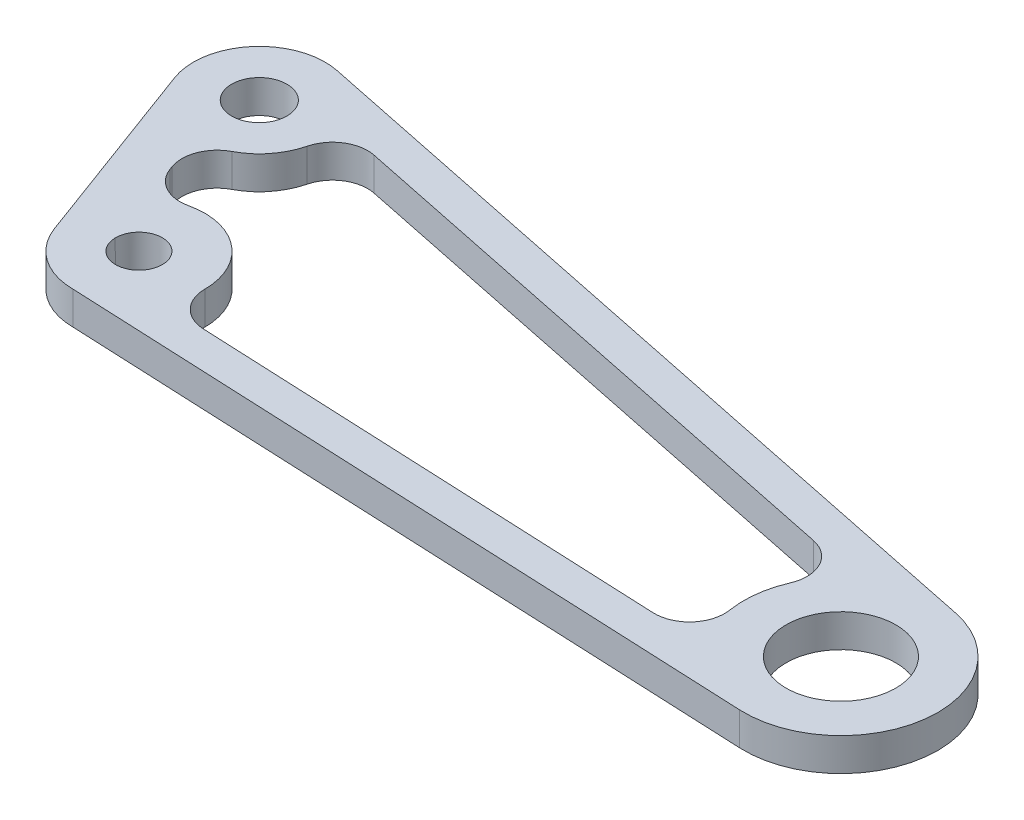
ISO-10303-21;
HEADER;
FILE_DESCRIPTION(('STEP AP214'),'2;1');
FILE_NAME('part.step','',(''),(''),'','','');
FILE_SCHEMA(('AUTOMOTIVE_DESIGN { 1 0 10303 214 1 1 1 1 }'));
ENDSEC;
DATA;
#1=APPLICATION_CONTEXT('core data for automotive mechanical design processes');
#2=APPLICATION_PROTOCOL_DEFINITION('international standard','automotive_design',2000,#1);
#3=PRODUCT_CONTEXT('',#1,'mechanical');
#4=PRODUCT('Part','Part','',(#3));
#5=PRODUCT_RELATED_PRODUCT_CATEGORY('part','',(#4));
#6=PRODUCT_DEFINITION_FORMATION('','',#4);
#7=PRODUCT_DEFINITION_CONTEXT('part definition',#1,'design');
#8=PRODUCT_DEFINITION('design','',#6,#7);
#9=PRODUCT_DEFINITION_SHAPE('','',#8);
#10=(LENGTH_UNIT() NAMED_UNIT(*) SI_UNIT(.MILLI.,.METRE.));
#11=(NAMED_UNIT(*) PLANE_ANGLE_UNIT() SI_UNIT($,.RADIAN.));
#12=(NAMED_UNIT(*) SI_UNIT($,.STERADIAN.) SOLID_ANGLE_UNIT());
#13=UNCERTAINTY_MEASURE_WITH_UNIT(LENGTH_MEASURE(1.E-05),#10,'distance_accuracy_value','');
#14=(GEOMETRIC_REPRESENTATION_CONTEXT(3) GLOBAL_UNCERTAINTY_ASSIGNED_CONTEXT((#13)) GLOBAL_UNIT_ASSIGNED_CONTEXT((#10,
#11,#12)) REPRESENTATION_CONTEXT('',''));
#15=CARTESIAN_POINT('',(0.,0.,0.));
#16=DIRECTION('',(0.,0.,1.));
#17=DIRECTION('',(1.,0.,0.));
#18=AXIS2_PLACEMENT_3D('',#15,#16,#17);
#19=CARTESIAN_POINT('',(0.,4.7625,0.));
#20=DIRECTION('',(0.,-1.,0.));
#21=DIRECTION('',(0.,0.,-1.));
#22=AXIS2_PLACEMENT_3D('',#19,#20,#21);
#23=CYLINDRICAL_SURFACE('',#22,3.3782);
#24=CARTESIAN_POINT('',(0.,4.7625,0.));
#25=DIRECTION('',(0.,1.,0.));
#26=DIRECTION('',(0.,0.,1.));
#27=AXIS2_PLACEMENT_3D('',#24,#25,#26);
#28=CIRCLE('',#27,3.3782);
#29=CARTESIAN_POINT('',(-3.37699494452161,4.7625,0.0902240803526804));
#30=VERTEX_POINT('',#29);
#31=CARTESIAN_POINT('',(3.37815685421566,4.7625,-0.0170736146063141));
#32=VERTEX_POINT('',#31);
#33=EDGE_CURVE('E238',#30,#32,#28,.T.);
#34=ORIENTED_EDGE('',*,*,#33,.T.);
#35=CARTESIAN_POINT('',(0.,3.17500000000001,0.));
#36=DIRECTION('',(-0.0158776138891677,0.0230363081876063,-0.999608538320013));
#37=DIRECTION('',(-0.000365858695107219,-0.99973462904167,-0.0230334027518643));
#38=AXIS2_PLACEMENT_3D('',#35,#36,#37);
#39=ELLIPSE('',#38,146.646761819999,3.3782);
#40=CARTESIAN_POINT('',(3.37581983633548,0.,-0.126789875794162));
#41=VERTEX_POINT('',#40);
#42=EDGE_CURVE('E12',#32,#41,#39,.T.);
#43=ORIENTED_EDGE('',*,*,#42,.T.);
#44=CARTESIAN_POINT('',(0.,0.,0.));
#45=DIRECTION('',(0.,1.,0.));
#46=DIRECTION('',(0.,0.,1.));
#47=AXIS2_PLACEMENT_3D('',#44,#45,#46);
#48=CIRCLE('',#47,3.3782);
#49=CARTESIAN_POINT('',(-3.37814365572359,0.,-0.0195110556985716));
#50=VERTEX_POINT('',#49);
#51=EDGE_CURVE('E217',#50,#41,#48,.T.);
#52=ORIENTED_EDGE('',*,*,#51,.F.);
#53=CARTESIAN_POINT('',(0.,3.17500000000001,0.));
#54=DIRECTION('',(-0.0158776138891677,0.0230363081876063,-0.999608538320013));
#55=DIRECTION('',(-0.000365858695107219,-0.99973462904167,-0.0230334027518643));
#56=AXIS2_PLACEMENT_3D('',#53,#54,#55);
#57=ELLIPSE('',#56,146.646761819999,3.3782);
#58=EDGE_CURVE('E59',#50,#30,#57,.T.);
#59=ORIENTED_EDGE('',*,*,#58,.T.);
#60=EDGE_LOOP('',(#34,#43,#52,#59));
#61=FACE_BOUND('',#60,.T.);
#62=ADVANCED_FACE('F50',(#61),#23,.F.);
#63=CARTESIAN_POINT('',(0.,4.7625,0.));
#64=DIRECTION('',(0.,1.,0.));
#65=DIRECTION('',(0.,0.,1.));
#66=AXIS2_PLACEMENT_3D('',#63,#64,#65);
#67=PLANE('',#66);
#68=DIRECTION('',(0.979429173631594,0.,0.201788240091771));
#69=VECTOR('',#68,1.);
#70=CARTESIAN_POINT('',(6.96734629176327,4.7625,-33.8177399131058));
#71=LINE('',#70,#69);
#72=CARTESIAN_POINT('',(-8.30441673152731,4.7625,-36.9641258555849));
#73=VERTEX_POINT('',#72);
#74=CARTESIAN_POINT('',(104.396235267328,4.7625,-13.744819308159));
#75=VERTEX_POINT('',#74);
#76=EDGE_CURVE('E189',#73,#75,#71,.T.);
#77=ORIENTED_EDGE('',*,*,#76,.F.);
#78=CARTESIAN_POINT('',(-10.2264497184014,4.7625,-27.635062976744));
#79=DIRECTION('',(0.,1.,0.));
#80=DIRECTION('',(0.,0.,1.));
#81=AXIS2_PLACEMENT_3D('',#78,#79,#80);
#82=CIRCLE('',#81,9.52500000000002);
#83=CARTESIAN_POINT('',(-19.1594284411659,4.7625,-24.3293836004829));
#84=VERTEX_POINT('',#83);
#85=EDGE_CURVE('E199',#73,#84,#82,.T.);
#86=ORIENTED_EDGE('',*,*,#85,.T.);
#87=DIRECTION('',(0.347052952888308,0.,0.937845535198364));
#88=VECTOR('',#87,1.);
#89=CARTESIAN_POINT('',(-8.93297872276443,4.7625,3.30567937626113));
#90=LINE('',#89,#88);
#91=CARTESIAN_POINT('',(-8.93297872276443,4.7625,3.30567937626113));
#92=VERTEX_POINT('',#91);
#93=EDGE_CURVE('E205',#84,#92,#90,.T.);
#94=ORIENTED_EDGE('',*,*,#93,.T.);
#95=CARTESIAN_POINT('',(0.,4.7625,0.));
#96=DIRECTION('',(0.,1.,0.));
#97=DIRECTION('',(0.,0.,1.));
#98=AXIS2_PLACEMENT_3D('',#95,#96,#97);
#99=CIRCLE('',#98,9.525);
#100=CARTESIAN_POINT('',(0.,4.7625,9.525));
#101=VERTEX_POINT('',#100);
#102=EDGE_CURVE('E225',#92,#101,#99,.T.);
#103=ORIENTED_EDGE('',*,*,#102,.T.);
#104=DIRECTION('',(0.999010124972066,0.,0.044483369963356));
#105=VECTOR('',#104,1.);
#106=CARTESIAN_POINT('',(-0.42328468479423,4.7625,9.5061522138136));
#107=LINE('',#106,#105);
#108=CARTESIAN_POINT('',(100.940182627619,4.7625,14.0196085887955));
#109=VERTEX_POINT('',#108);
#110=EDGE_CURVE('E228',#101,#109,#107,.T.);
#111=ORIENTED_EDGE('',*,*,#110,.T.);
#112=CARTESIAN_POINT('',(101.56444,4.7625,0.));
#113=DIRECTION('',(0.,1.,0.));
#114=DIRECTION('',(0.,0.,1.));
#115=AXIS2_PLACEMENT_3D('',#112,#113,#114);
#116=CIRCLE('',#115,14.0335);
#117=EDGE_CURVE('E210',#109,#75,#116,.T.);
#118=ORIENTED_EDGE('',*,*,#117,.T.);
#119=EDGE_LOOP('',(#77,#86,#94,#103,#111,#118));
#120=FACE_BOUND('',#119,.T.);
#121=CARTESIAN_POINT('',(101.56444,4.7625,0.));
#122=DIRECTION('',(0.,1.,0.));
#123=DIRECTION('',(0.,0.,1.));
#124=AXIS2_PLACEMENT_3D('',#121,#122,#123);
#125=CIRCLE('',#124,7.93749999999999);
#126=CARTESIAN_POINT('',(101.56444,4.7625,-7.93749999999999));
#127=VERTEX_POINT('',#126);
#128=EDGE_CURVE('E233',#127,#127,#125,.T.);
#129=ORIENTED_EDGE('',*,*,#128,.F.);
#130=EDGE_LOOP('',(#129));
#131=FACE_BOUND('',#130,.T.);
#132=ORIENTED_EDGE('',*,*,#33,.F.);
#133=EDGE_CURVE('E237',#32,#30,#28,.T.);
#134=ORIENTED_EDGE('',*,*,#133,.F.);
#135=EDGE_LOOP('',(#132,#134));
#136=FACE_BOUND('',#135,.T.);
#137=CARTESIAN_POINT('',(-10.2264497184014,4.7625,-27.635062976744));
#138=DIRECTION('',(0.,1.,0.));
#139=DIRECTION('',(0.,0.,1.));
#140=AXIS2_PLACEMENT_3D('',#137,#138,#139);
#141=CIRCLE('',#140,4.);
#142=CARTESIAN_POINT('',(-10.2264497184014,4.7625,-31.635062976744));
#143=VERTEX_POINT('',#142);
#144=EDGE_CURVE('E241',#143,#143,#141,.T.);
#145=ORIENTED_EDGE('',*,*,#144,.F.);
#146=EDGE_LOOP('',(#145));
#147=FACE_BOUND('',#146,.T.);
#148=DIRECTION('',(0.999010124972066,0.,0.044483369963356));
#149=VECTOR('',#148,1.);
#150=CARTESIAN_POINT('',(-0.197309165380382,4.7625,4.4311807789555));
#151=LINE('',#150,#149);
#152=CARTESIAN_POINT('',(14.379023534751,4.7625,5.08022765445843));
#153=VERTEX_POINT('',#152);
#154=CARTESIAN_POINT('',(82.4677979648595,4.7625,8.11204691996457));
#155=VERTEX_POINT('',#154);
#156=EDGE_CURVE('E442',#153,#155,#151,.T.);
#157=ORIENTED_EDGE('',*,*,#156,.F.);
#158=CARTESIAN_POINT('',(14.6049990541648,4.7625,0.00525621960033242));
#159=DIRECTION('',(0.,1.,0.));
#160=DIRECTION('',(0.,0.,1.));
#161=AXIS2_PLACEMENT_3D('',#158,#159,#160);
#162=CIRCLE('',#161,5.08);
#163=CARTESIAN_POINT('',(9.52499938315098,4.7625,0.00342796930456462));
#164=VERTEX_POINT('',#163);
#165=EDGE_CURVE('E360',#153,#164,#162,.F.);
#166=ORIENTED_EDGE('',*,*,#165,.T.);
#167=CARTESIAN_POINT('',(0.,4.7625,0.));
#168=DIRECTION('',(0.,1.,0.));
#169=DIRECTION('',(0.,0.,1.));
#170=AXIS2_PLACEMENT_3D('',#167,#168,#169);
#171=CIRCLE('',#170,9.525);
#172=CARTESIAN_POINT('',(-2.11226746056986,4.7625,-9.28783888614665));
#173=VERTEX_POINT('',#172);
#174=EDGE_CURVE('E450',#164,#173,#171,.T.);
#175=ORIENTED_EDGE('',*,*,#174,.T.);
#176=CARTESIAN_POINT('',(-3.23881010620712,4.7625,-14.2413529587582));
#177=DIRECTION('',(0.,1.,0.));
#178=DIRECTION('',(0.,0.,1.));
#179=AXIS2_PLACEMENT_3D('',#176,#177,#178);
#180=CIRCLE('',#179,5.08);
#181=CARTESIAN_POINT('',(-8.00306542501481,4.7625,-12.4783239580856));
#182=VERTEX_POINT('',#181);
#183=EDGE_CURVE('E330',#173,#182,#180,.F.);
#184=ORIENTED_EDGE('',*,*,#183,.T.);
#185=DIRECTION('',(0.347052952888308,0.,0.937845535198364));
#186=VECTOR('',#185,1.);
#187=CARTESIAN_POINT('',(-2.97765957425481,4.7625,1.10189312542038));
#188=LINE('',#187,#186);
#189=CARTESIAN_POINT('',(-8.17870344189627,4.7625,-12.9529527678176));
#190=VERTEX_POINT('',#189);
#191=EDGE_CURVE('E220',#190,#182,#188,.T.);
#192=ORIENTED_EDGE('',*,*,#191,.F.);
#193=CARTESIAN_POINT('',(-3.41444812308858,4.7625,-14.7159817684902));
#194=DIRECTION('',(0.,1.,0.));
#195=DIRECTION('',(0.,0.,1.));
#196=AXIS2_PLACEMENT_3D('',#193,#194,#195);
#197=CIRCLE('',#196,5.08);
#198=CARTESIAN_POINT('',(-5.78383998232783,4.7625,-19.2095752322307));
#199=VERTEX_POINT('',#198);
#200=EDGE_CURVE('E336',#190,#199,#197,.F.);
#201=ORIENTED_EDGE('',*,*,#200,.T.);
#202=CARTESIAN_POINT('',(-10.2264497184014,4.7625,-27.635062976744));
#203=DIRECTION('',(0.,1.,0.));
#204=DIRECTION('',(0.,0.,1.));
#205=AXIS2_PLACEMENT_3D('',#202,#203,#204);
#206=CIRCLE('',#205,9.52500000000001);
#207=CARTESIAN_POINT('',(-0.989775302005681,4.7625,-25.3092360860447));
#208=VERTEX_POINT('',#207);
#209=EDGE_CURVE('E461',#199,#208,#206,.T.);
#210=ORIENTED_EDGE('',*,*,#209,.T.);
#211=CARTESIAN_POINT('',(3.93645105340539,4.7625,-24.0687950776717));
#212=DIRECTION('',(0.,1.,0.));
#213=DIRECTION('',(0.,0.,1.));
#214=AXIS2_PLACEMENT_3D('',#211,#212,#213);
#215=CIRCLE('',#214,5.08);
#216=CARTESIAN_POINT('',(4.96153531307158,4.7625,-29.0442952797202));
#217=VERTEX_POINT('',#216);
#218=EDGE_CURVE('E354',#208,#217,#215,.F.);
#219=ORIENTED_EDGE('',*,*,#218,.T.);
#220=DIRECTION('',(0.979429173631593,0.,0.20178824009177));
#221=VECTOR('',#220,1.);
#222=CARTESIAN_POINT('',(5.94226203209708,4.7625,-28.8422397110573));
#223=LINE('',#222,#221);
#224=CARTESIAN_POINT('',(85.0392852900803,4.7625,-12.5461669071959));
#225=VERTEX_POINT('',#224);
#226=EDGE_CURVE('E454',#217,#225,#223,.T.);
#227=ORIENTED_EDGE('',*,*,#226,.T.);
#228=CARTESIAN_POINT('',(84.0142010304141,4.7625,-7.57066670514743));
#229=DIRECTION('',(0.,1.,0.));
#230=DIRECTION('',(0.,0.,1.));
#231=AXIS2_PLACEMENT_3D('',#228,#229,#230);
#232=CIRCLE('',#231,5.08);
#233=CARTESIAN_POINT('',(88.6787163711678,4.7625,-5.55852937487568));
#234=VERTEX_POINT('',#233);
#235=EDGE_CURVE('E342',#225,#234,#232,.F.);
#236=ORIENTED_EDGE('',*,*,#235,.T.);
#237=CARTESIAN_POINT('',(101.56444,4.7625,0.));
#238=DIRECTION('',(0.,1.,0.));
#239=DIRECTION('',(0.,0.,1.));
#240=AXIS2_PLACEMENT_3D('',#237,#238,#239);
#241=CIRCLE('',#240,14.0335);
#242=CARTESIAN_POINT('',(87.7092330233369,4.7625,2.22987934288549));
#243=VERTEX_POINT('',#242);
#244=EDGE_CURVE('E449',#234,#243,#241,.T.);
#245=ORIENTED_EDGE('',*,*,#244,.T.);
#246=CARTESIAN_POINT('',(82.6937734842734,4.7625,3.03707548510648));
#247=DIRECTION('',(0.,1.,0.));
#248=DIRECTION('',(0.,0.,1.));
#249=AXIS2_PLACEMENT_3D('',#246,#247,#248);
#250=CIRCLE('',#249,5.08);
#251=EDGE_CURVE('E348',#243,#155,#250,.F.);
#252=ORIENTED_EDGE('',*,*,#251,.T.);
#253=EDGE_LOOP('',(#157,#166,#175,#184,#192,#201,#210,#219,#227,#236,#245,#252));
#254=FACE_BOUND('',#253,.T.);
#255=ADVANCED_FACE('F207',(#120,#131,#136,#147,#254),#67,.T.);
#256=CARTESIAN_POINT('',(0.,0.,0.));
#257=DIRECTION('',(0.,1.,0.));
#258=DIRECTION('',(0.,0.,1.));
#259=AXIS2_PLACEMENT_3D('',#256,#257,#258);
#260=PLANE('',#259);
#261=CARTESIAN_POINT('',(-10.2264497184014,0.,-27.635062976744));
#262=DIRECTION('',(0.,1.,0.));
#263=DIRECTION('',(0.,0.,1.));
#264=AXIS2_PLACEMENT_3D('',#261,#262,#263);
#265=CIRCLE('',#264,4.);
#266=CARTESIAN_POINT('',(-10.2264497184014,0.,-31.635062976744));
#267=VERTEX_POINT('',#266);
#268=EDGE_CURVE('E213',#267,#267,#265,.T.);
#269=ORIENTED_EDGE('',*,*,#268,.T.);
#270=EDGE_LOOP('',(#269));
#271=FACE_BOUND('',#270,.T.);
#272=ORIENTED_EDGE('',*,*,#51,.T.);
#273=EDGE_CURVE('E269',#41,#50,#48,.T.);
#274=ORIENTED_EDGE('',*,*,#273,.T.);
#275=EDGE_LOOP('',(#272,#274));
#276=FACE_BOUND('',#275,.T.);
#277=CARTESIAN_POINT('',(101.56444,0.,0.));
#278=DIRECTION('',(0.,1.,0.));
#279=DIRECTION('',(0.,0.,1.));
#280=AXIS2_PLACEMENT_3D('',#277,#278,#279);
#281=CIRCLE('',#280,7.93749999999999);
#282=CARTESIAN_POINT('',(101.56444,0.,-7.93749999999999));
#283=VERTEX_POINT('',#282);
#284=EDGE_CURVE('E265',#283,#283,#281,.T.);
#285=ORIENTED_EDGE('',*,*,#284,.T.);
#286=EDGE_LOOP('',(#285));
#287=FACE_BOUND('',#286,.T.);
#288=DIRECTION('',(0.979429173631594,0.,0.201788240091771));
#289=VECTOR('',#288,1.);
#290=CARTESIAN_POINT('',(6.96734629176327,0.,-33.8177399131058));
#291=LINE('',#290,#289);
#292=CARTESIAN_POINT('',(-8.30441673152731,0.,-36.9641258555849));
#293=VERTEX_POINT('',#292);
#294=CARTESIAN_POINT('',(104.396235267328,0.,-13.744819308159));
#295=VERTEX_POINT('',#294);
#296=EDGE_CURVE('E191',#293,#295,#291,.T.);
#297=ORIENTED_EDGE('',*,*,#296,.T.);
#298=CARTESIAN_POINT('',(101.56444,0.,0.));
#299=DIRECTION('',(0.,1.,0.));
#300=DIRECTION('',(0.,0.,1.));
#301=AXIS2_PLACEMENT_3D('',#298,#299,#300);
#302=CIRCLE('',#301,14.0335);
#303=CARTESIAN_POINT('',(100.940182627619,0.,14.0196085887955));
#304=VERTEX_POINT('',#303);
#305=EDGE_CURVE('E261',#304,#295,#302,.T.);
#306=ORIENTED_EDGE('',*,*,#305,.F.);
#307=DIRECTION('',(0.999010124972066,0.,0.044483369963356));
#308=VECTOR('',#307,1.);
#309=CARTESIAN_POINT('',(-0.42328468479423,0.,9.5061522138136));
#310=LINE('',#309,#308);
#311=CARTESIAN_POINT('',(0.,0.,9.525));
#312=VERTEX_POINT('',#311);
#313=EDGE_CURVE('E258',#312,#304,#310,.T.);
#314=ORIENTED_EDGE('',*,*,#313,.F.);
#315=CARTESIAN_POINT('',(0.,0.,0.));
#316=DIRECTION('',(0.,1.,0.));
#317=DIRECTION('',(0.,0.,1.));
#318=AXIS2_PLACEMENT_3D('',#315,#316,#317);
#319=CIRCLE('',#318,9.525);
#320=CARTESIAN_POINT('',(-8.93297872276443,0.,3.30567937626113));
#321=VERTEX_POINT('',#320);
#322=EDGE_CURVE('E255',#321,#312,#319,.T.);
#323=ORIENTED_EDGE('',*,*,#322,.F.);
#324=DIRECTION('',(0.347052952888308,0.,0.937845535198364));
#325=VECTOR('',#324,1.);
#326=CARTESIAN_POINT('',(-8.93297872276443,0.,3.30567937626113));
#327=LINE('',#326,#325);
#328=CARTESIAN_POINT('',(-19.1594284411659,0.,-24.3293836004829));
#329=VERTEX_POINT('',#328);
#330=EDGE_CURVE('E252',#329,#321,#327,.T.);
#331=ORIENTED_EDGE('',*,*,#330,.F.);
#332=CARTESIAN_POINT('',(-10.2264497184014,0.,-27.635062976744));
#333=DIRECTION('',(0.,1.,0.));
#334=DIRECTION('',(0.,0.,1.));
#335=AXIS2_PLACEMENT_3D('',#332,#333,#334);
#336=CIRCLE('',#335,9.52500000000002);
#337=EDGE_CURVE('E248',#293,#329,#336,.T.);
#338=ORIENTED_EDGE('',*,*,#337,.F.);
#339=EDGE_LOOP('',(#297,#306,#314,#323,#331,#338));
#340=FACE_BOUND('',#339,.T.);
#341=CARTESIAN_POINT('',(0.,0.,0.));
#342=DIRECTION('',(0.,1.,0.));
#343=DIRECTION('',(0.,0.,1.));
#344=AXIS2_PLACEMENT_3D('',#341,#342,#343);
#345=CIRCLE('',#344,9.525);
#346=CARTESIAN_POINT('',(9.52499938315098,0.,0.00342796930456462));
#347=VERTEX_POINT('',#346);
#348=CARTESIAN_POINT('',(-2.11226746056986,0.,-9.28783888614665));
#349=VERTEX_POINT('',#348);
#350=EDGE_CURVE('E425',#347,#349,#345,.T.);
#351=ORIENTED_EDGE('',*,*,#350,.F.);
#352=CARTESIAN_POINT('',(14.6049990541648,0.,0.00525621960033242));
#353=DIRECTION('',(0.,1.,0.));
#354=DIRECTION('',(0.,0.,1.));
#355=AXIS2_PLACEMENT_3D('',#352,#353,#354);
#356=CIRCLE('',#355,5.08);
#357=CARTESIAN_POINT('',(14.379023534751,0.,5.08022765445843));
#358=VERTEX_POINT('',#357);
#359=EDGE_CURVE('E363',#347,#358,#356,.T.);
#360=ORIENTED_EDGE('',*,*,#359,.T.);
#361=DIRECTION('',(0.999010124972066,0.,0.044483369963356));
#362=VECTOR('',#361,1.);
#363=CARTESIAN_POINT('',(-0.197309165380382,0.,4.4311807789555));
#364=LINE('',#363,#362);
#365=CARTESIAN_POINT('',(82.4677979648595,0.,8.11204691996457));
#366=VERTEX_POINT('',#365);
#367=EDGE_CURVE('E433',#358,#366,#364,.T.);
#368=ORIENTED_EDGE('',*,*,#367,.T.);
#369=CARTESIAN_POINT('',(82.6937734842734,0.,3.03707548510648));
#370=DIRECTION('',(0.,1.,0.));
#371=DIRECTION('',(0.,0.,1.));
#372=AXIS2_PLACEMENT_3D('',#369,#370,#371);
#373=CIRCLE('',#372,5.08);
#374=CARTESIAN_POINT('',(87.7092330233369,0.,2.22987934288549));
#375=VERTEX_POINT('',#374);
#376=EDGE_CURVE('E351',#366,#375,#373,.T.);
#377=ORIENTED_EDGE('',*,*,#376,.T.);
#378=CARTESIAN_POINT('',(101.56444,0.,0.));
#379=DIRECTION('',(0.,1.,0.));
#380=DIRECTION('',(0.,0.,1.));
#381=AXIS2_PLACEMENT_3D('',#378,#379,#380);
#382=CIRCLE('',#381,14.0335);
#383=CARTESIAN_POINT('',(88.6787163711678,0.,-5.55852937487568));
#384=VERTEX_POINT('',#383);
#385=EDGE_CURVE('E516',#384,#375,#382,.T.);
#386=ORIENTED_EDGE('',*,*,#385,.F.);
#387=CARTESIAN_POINT('',(84.0142010304141,0.,-7.57066670514743));
#388=DIRECTION('',(0.,1.,0.));
#389=DIRECTION('',(0.,0.,1.));
#390=AXIS2_PLACEMENT_3D('',#387,#388,#389);
#391=CIRCLE('',#390,5.08);
#392=CARTESIAN_POINT('',(85.0392852900803,0.,-12.5461669071959));
#393=VERTEX_POINT('',#392);
#394=EDGE_CURVE('E345',#384,#393,#391,.T.);
#395=ORIENTED_EDGE('',*,*,#394,.T.);
#396=DIRECTION('',(0.979429173631593,0.,0.20178824009177));
#397=VECTOR('',#396,1.);
#398=CARTESIAN_POINT('',(5.94226203209708,0.,-28.8422397110573));
#399=LINE('',#398,#397);
#400=CARTESIAN_POINT('',(4.96153531307158,0.,-29.0442952797202));
#401=VERTEX_POINT('',#400);
#402=EDGE_CURVE('E508',#401,#393,#399,.T.);
#403=ORIENTED_EDGE('',*,*,#402,.F.);
#404=CARTESIAN_POINT('',(3.93645105340539,0.,-24.0687950776717));
#405=DIRECTION('',(0.,1.,0.));
#406=DIRECTION('',(0.,0.,1.));
#407=AXIS2_PLACEMENT_3D('',#404,#405,#406);
#408=CIRCLE('',#407,5.08);
#409=CARTESIAN_POINT('',(-0.989775302005681,0.,-25.3092360860447));
#410=VERTEX_POINT('',#409);
#411=EDGE_CURVE('E357',#401,#410,#408,.T.);
#412=ORIENTED_EDGE('',*,*,#411,.T.);
#413=CARTESIAN_POINT('',(-10.2264497184014,0.,-27.635062976744));
#414=DIRECTION('',(0.,1.,0.));
#415=DIRECTION('',(0.,0.,1.));
#416=AXIS2_PLACEMENT_3D('',#413,#414,#415);
#417=CIRCLE('',#416,9.52500000000001);
#418=CARTESIAN_POINT('',(-5.78383998232783,0.,-19.2095752322307));
#419=VERTEX_POINT('',#418);
#420=EDGE_CURVE('E505',#419,#410,#417,.T.);
#421=ORIENTED_EDGE('',*,*,#420,.F.);
#422=CARTESIAN_POINT('',(-3.41444812308858,0.,-14.7159817684902));
#423=DIRECTION('',(0.,1.,0.));
#424=DIRECTION('',(0.,0.,1.));
#425=AXIS2_PLACEMENT_3D('',#422,#423,#424);
#426=CIRCLE('',#425,5.08);
#427=CARTESIAN_POINT('',(-8.17870344189627,0.,-12.9529527678176));
#428=VERTEX_POINT('',#427);
#429=EDGE_CURVE('E339',#419,#428,#426,.T.);
#430=ORIENTED_EDGE('',*,*,#429,.T.);
#431=DIRECTION('',(0.347052952888308,0.,0.937845535198364));
#432=VECTOR('',#431,1.);
#433=CARTESIAN_POINT('',(-2.97765957425481,0.,1.10189312542038));
#434=LINE('',#433,#432);
#435=CARTESIAN_POINT('',(-8.00306542501481,0.,-12.4783239580856));
#436=VERTEX_POINT('',#435);
#437=EDGE_CURVE('E249',#428,#436,#434,.T.);
#438=ORIENTED_EDGE('',*,*,#437,.T.);
#439=CARTESIAN_POINT('',(-3.23881010620712,0.,-14.2413529587582));
#440=DIRECTION('',(0.,1.,0.));
#441=DIRECTION('',(0.,0.,1.));
#442=AXIS2_PLACEMENT_3D('',#439,#440,#441);
#443=CIRCLE('',#442,5.08);
#444=EDGE_CURVE('E333',#436,#349,#443,.T.);
#445=ORIENTED_EDGE('',*,*,#444,.T.);
#446=EDGE_LOOP('',(#351,#360,#368,#377,#386,#395,#403,#412,#421,#430,#438,#445));
#447=FACE_BOUND('',#446,.T.);
#448=ADVANCED_FACE('F394',(#271,#276,#287,#340,#447),#260,.F.);
#449=CARTESIAN_POINT('',(6.96734629176327,4.7625,-33.8177399131058));
#450=DIRECTION('',(0.201788240091771,0.,-0.979429173631593));
#451=DIRECTION('',(-0.979429173631593,0.,-0.201788240091771));
#452=AXIS2_PLACEMENT_3D('',#449,#450,#451);
#453=PLANE('',#452);
#454=ORIENTED_EDGE('',*,*,#296,.F.);
#455=DIRECTION('',(0.,-1.,0.));
#456=VECTOR('',#455,1.);
#457=CARTESIAN_POINT('',(-8.30441673152731,4.7625,-36.9641258555849));
#458=LINE('',#457,#456);
#459=EDGE_CURVE('E185',#73,#293,#458,.T.);
#460=ORIENTED_EDGE('',*,*,#459,.F.);
#461=ORIENTED_EDGE('',*,*,#76,.T.);
#462=DIRECTION('',(0.,-1.,0.));
#463=VECTOR('',#462,1.);
#464=CARTESIAN_POINT('',(104.396235267328,4.7625,-13.744819308159));
#465=LINE('',#464,#463);
#466=EDGE_CURVE('E245',#75,#295,#465,.T.);
#467=ORIENTED_EDGE('',*,*,#466,.T.);
#468=EDGE_LOOP('',(#454,#460,#461,#467));
#469=FACE_BOUND('',#468,.T.);
#470=ADVANCED_FACE('F187',(#469),#453,.T.);
#471=CARTESIAN_POINT('',(-10.2264497184014,4.7625,-27.635062976744));
#472=DIRECTION('',(0.,-1.,0.));
#473=DIRECTION('',(0.,0.,-1.));
#474=AXIS2_PLACEMENT_3D('',#471,#472,#473);
#475=CYLINDRICAL_SURFACE('',#474,9.52500000000002);
#476=ORIENTED_EDGE('',*,*,#337,.T.);
#477=DIRECTION('',(0.,-1.,0.));
#478=VECTOR('',#477,1.);
#479=CARTESIAN_POINT('',(-19.1594284411659,4.7625,-24.3293836004829));
#480=LINE('',#479,#478);
#481=EDGE_CURVE('E196',#84,#329,#480,.T.);
#482=ORIENTED_EDGE('',*,*,#481,.F.);
#483=ORIENTED_EDGE('',*,*,#85,.F.);
#484=ORIENTED_EDGE('',*,*,#459,.T.);
#485=EDGE_LOOP('',(#476,#482,#483,#484));
#486=FACE_BOUND('',#485,.T.);
#487=ADVANCED_FACE('F200',(#486),#475,.T.);
#488=CARTESIAN_POINT('',(-8.93297872276443,4.7625,3.30567937626113));
#489=DIRECTION('',(0.937845535198364,0.,-0.347052952888308));
#490=DIRECTION('',(-0.347052952888308,0.,-0.937845535198364));
#491=AXIS2_PLACEMENT_3D('',#488,#489,#490);
#492=PLANE('',#491);
#493=ORIENTED_EDGE('',*,*,#330,.T.);
#494=DIRECTION('',(0.,-1.,0.));
#495=VECTOR('',#494,1.);
#496=CARTESIAN_POINT('',(-8.93297872276443,4.7625,3.30567937626113));
#497=LINE('',#496,#495);
#498=EDGE_CURVE('E283',#92,#321,#497,.T.);
#499=ORIENTED_EDGE('',*,*,#498,.F.);
#500=ORIENTED_EDGE('',*,*,#93,.F.);
#501=ORIENTED_EDGE('',*,*,#481,.T.);
#502=EDGE_LOOP('',(#493,#499,#500,#501));
#503=FACE_BOUND('',#502,.T.);
#504=ADVANCED_FACE('F673',(#503),#492,.F.);
#505=CARTESIAN_POINT('',(0.,4.7625,0.));
#506=DIRECTION('',(0.,-1.,0.));
#507=DIRECTION('',(0.,0.,-1.));
#508=AXIS2_PLACEMENT_3D('',#505,#506,#507);
#509=CYLINDRICAL_SURFACE('',#508,9.525);
#510=ORIENTED_EDGE('',*,*,#322,.T.);
#511=DIRECTION('',(0.,-1.,0.));
#512=VECTOR('',#511,1.);
#513=CARTESIAN_POINT('',(0.,4.7625,9.525));
#514=LINE('',#513,#512);
#515=EDGE_CURVE('E279',#101,#312,#514,.T.);
#516=ORIENTED_EDGE('',*,*,#515,.F.);
#517=ORIENTED_EDGE('',*,*,#102,.F.);
#518=ORIENTED_EDGE('',*,*,#498,.T.);
#519=EDGE_LOOP('',(#510,#516,#517,#518));
#520=FACE_BOUND('',#519,.T.);
#521=ADVANCED_FACE('F385',(#520),#509,.T.);
#522=CARTESIAN_POINT('',(-0.42328468479423,4.7625,9.5061522138136));
#523=DIRECTION('',(0.044483369963356,0.,-0.999010124972066));
#524=DIRECTION('',(-0.999010124972066,0.,-0.044483369963356));
#525=AXIS2_PLACEMENT_3D('',#522,#523,#524);
#526=PLANE('',#525);
#527=ORIENTED_EDGE('',*,*,#313,.T.);
#528=DIRECTION('',(0.,-1.,0.));
#529=VECTOR('',#528,1.);
#530=CARTESIAN_POINT('',(100.940182627619,4.7625,14.0196085887955));
#531=LINE('',#530,#529);
#532=EDGE_CURVE('E275',#109,#304,#531,.T.);
#533=ORIENTED_EDGE('',*,*,#532,.F.);
#534=ORIENTED_EDGE('',*,*,#110,.F.);
#535=ORIENTED_EDGE('',*,*,#515,.T.);
#536=EDGE_LOOP('',(#527,#533,#534,#535));
#537=FACE_BOUND('',#536,.T.);
#538=ADVANCED_FACE('F375',(#537),#526,.F.);
#539=ORIENTED_EDGE('',*,*,#42,.F.);
#540=ORIENTED_EDGE('',*,*,#133,.T.);
#541=ORIENTED_EDGE('',*,*,#58,.F.);
#542=ORIENTED_EDGE('',*,*,#273,.F.);
#543=EDGE_LOOP('',(#539,#540,#541,#542));
#544=FACE_BOUND('',#543,.T.);
#545=ADVANCED_FACE('F372',(#544),#23,.F.);
#546=CARTESIAN_POINT('',(101.56444,4.7625,0.));
#547=DIRECTION('',(0.,-1.,0.));
#548=DIRECTION('',(0.,0.,-1.));
#549=AXIS2_PLACEMENT_3D('',#546,#547,#548);
#550=CYLINDRICAL_SURFACE('',#549,7.93749999999999);
#551=CARTESIAN_POINT('',(101.56444,4.7625,-7.93749999999999));
#552=CARTESIAN_POINT('',(101.56444,4.712890625,-7.93749999999999));
#553=CARTESIAN_POINT('',(101.56444,4.66328125,-7.93749999999999));
#554=CARTESIAN_POINT('',(101.56444,4.5640625,-7.93749999999999));
#555=CARTESIAN_POINT('',(101.56444,4.514453125,-7.93749999999999));
#556=CARTESIAN_POINT('',(101.56444,4.415234375,-7.93749999999999));
#557=CARTESIAN_POINT('',(101.56444,4.365625,-7.93749999999999));
#558=CARTESIAN_POINT('',(101.56444,4.26640625,-7.93749999999999));
#559=CARTESIAN_POINT('',(101.56444,4.216796875,-7.93749999999999));
#560=CARTESIAN_POINT('',(101.56444,4.117578125,-7.93749999999999));
#561=CARTESIAN_POINT('',(101.56444,4.06796875,-7.93749999999999));
#562=CARTESIAN_POINT('',(101.56444,3.96875,-7.93749999999999));
#563=CARTESIAN_POINT('',(101.56444,3.919140625,-7.93749999999999));
#564=CARTESIAN_POINT('',(101.56444,3.819921875,-7.93749999999999));
#565=CARTESIAN_POINT('',(101.56444,3.7703125,-7.93749999999999));
#566=CARTESIAN_POINT('',(101.56444,3.67109375,-7.93749999999999));
#567=CARTESIAN_POINT('',(101.56444,3.621484375,-7.93749999999999));
#568=CARTESIAN_POINT('',(101.56444,3.522265625,-7.93749999999999));
#569=CARTESIAN_POINT('',(101.56444,3.47265625,-7.93749999999999));
#570=CARTESIAN_POINT('',(101.56444,3.3734375,-7.93749999999999));
#571=CARTESIAN_POINT('',(101.56444,3.323828125,-7.93749999999999));
#572=CARTESIAN_POINT('',(101.56444,3.224609375,-7.93749999999999));
#573=CARTESIAN_POINT('',(101.56444,3.175,-7.93749999999999));
#574=CARTESIAN_POINT('',(101.56444,3.07578125,-7.93749999999999));
#575=CARTESIAN_POINT('',(101.56444,3.026171875,-7.93749999999999));
#576=CARTESIAN_POINT('',(101.56444,2.926953125,-7.93749999999999));
#577=CARTESIAN_POINT('',(101.56444,2.87734375,-7.93749999999999));
#578=CARTESIAN_POINT('',(101.56444,2.778125,-7.93749999999999));
#579=CARTESIAN_POINT('',(101.56444,2.728515625,-7.93749999999999));
#580=CARTESIAN_POINT('',(101.56444,2.629296875,-7.93749999999999));
#581=CARTESIAN_POINT('',(101.56444,2.5796875,-7.93749999999999));
#582=CARTESIAN_POINT('',(101.56444,2.48046875,-7.93749999999999));
#583=CARTESIAN_POINT('',(101.56444,2.430859375,-7.93749999999999));
#584=CARTESIAN_POINT('',(101.56444,2.331640625,-7.93749999999999));
#585=CARTESIAN_POINT('',(101.56444,2.28203125,-7.93749999999999));
#586=CARTESIAN_POINT('',(101.56444,2.1828125,-7.93749999999999));
#587=CARTESIAN_POINT('',(101.56444,2.133203125,-7.93749999999999));
#588=CARTESIAN_POINT('',(101.56444,2.033984375,-7.93749999999999));
#589=CARTESIAN_POINT('',(101.56444,1.984375,-7.93749999999999));
#590=CARTESIAN_POINT('',(101.56444,1.88515625,-7.93749999999999));
#591=CARTESIAN_POINT('',(101.56444,1.835546875,-7.93749999999999));
#592=CARTESIAN_POINT('',(101.56444,1.736328125,-7.93749999999999));
#593=CARTESIAN_POINT('',(101.56444,1.68671875,-7.93749999999999));
#594=CARTESIAN_POINT('',(101.56444,1.5875,-7.93749999999999));
#595=CARTESIAN_POINT('',(101.56444,1.537890625,-7.93749999999999));
#596=CARTESIAN_POINT('',(101.56444,1.438671875,-7.93749999999999));
#597=CARTESIAN_POINT('',(101.56444,1.3890625,-7.93749999999999));
#598=CARTESIAN_POINT('',(101.56444,1.28984375,-7.93749999999999));
#599=CARTESIAN_POINT('',(101.56444,1.240234375,-7.93749999999999));
#600=CARTESIAN_POINT('',(101.56444,1.141015625,-7.93749999999999));
#601=CARTESIAN_POINT('',(101.56444,1.09140625,-7.93749999999999));
#602=CARTESIAN_POINT('',(101.56444,0.9921875,-7.93749999999999));
#603=CARTESIAN_POINT('',(101.56444,0.942578125,-7.93749999999999));
#604=CARTESIAN_POINT('',(101.56444,0.843359375,-7.93749999999999));
#605=CARTESIAN_POINT('',(101.56444,0.79375,-7.93749999999999));
#606=CARTESIAN_POINT('',(101.56444,0.69453125,-7.93749999999999));
#607=CARTESIAN_POINT('',(101.56444,0.644921875,-7.93749999999999));
#608=CARTESIAN_POINT('',(101.56444,0.545703125,-7.93749999999999));
#609=CARTESIAN_POINT('',(101.56444,0.49609375,-7.93749999999999));
#610=CARTESIAN_POINT('',(101.56444,0.396875,-7.93749999999999));
#611=CARTESIAN_POINT('',(101.56444,0.347265625,-7.93749999999999));
#612=CARTESIAN_POINT('',(101.56444,0.248046875,-7.93749999999999));
#613=CARTESIAN_POINT('',(101.56444,0.1984375,-7.93749999999999));
#614=CARTESIAN_POINT('',(101.56444,0.09921875,-7.93749999999999));
#615=CARTESIAN_POINT('',(101.56444,0.049609375,-7.93749999999999));
#616=CARTESIAN_POINT('',(101.56444,0.,-7.93749999999999));
#617=B_SPLINE_CURVE_WITH_KNOTS('',3,(#551,#552,#553,#554,#555,#556,#557,#558,#559,#560,#561,
#562,#563,#564,#565,#566,#567,#568,#569,#570,#571,#572,#573,#574,#575,#576,#577,#578,#579,#580,
#581,#582,#583,#584,#585,#586,#587,#588,#589,#590,#591,#592,#593,#594,#595,#596,#597,#598,#599,
#600,#601,#602,#603,#604,#605,#606,#607,#608,#609,#610,#611,#612,#613,#614,#615,#616),
.UNSPECIFIED.,.F.,.F.,(4,2,2,2,2,2,2,2,2,2,2,2,2,2,2,2,2,2,2,2,2,2,2,2,2,2,2,2,2,2,2,2,4),(0.,
0.148828124999999,0.297656249999999,0.446484374999999,0.595312499999999,0.744140625,0.89296875,
1.041796875,1.190625,1.339453125,1.48828125,1.637109375,1.7859375,1.934765625,2.08359375,
2.232421875,2.38125,2.530078125,2.67890625,2.827734375,2.9765625,3.125390625,3.27421875,
3.423046875,3.571875,3.720703125,3.86953125,4.018359375,4.1671875,4.316015625,4.46484375,
4.613671875,4.7625),.UNSPECIFIED.);
#618=EDGE_CURVE('BSEAM374',#127,#283,#617,.T.);
#619=ORIENTED_EDGE('',*,*,#128,.T.);
#620=ORIENTED_EDGE('',*,*,#284,.F.);
#621=ORIENTED_EDGE('',*,*,#618,.T.);
#622=ORIENTED_EDGE('',*,*,#618,.F.);
#623=EDGE_LOOP('',(#619,#621,#620,#622));
#624=FACE_BOUND('',#623,.T.);
#625=ADVANCED_FACE('F374',(#624),#550,.F.);
#626=CARTESIAN_POINT('',(101.56444,4.7625,0.));
#627=DIRECTION('',(0.,-1.,0.));
#628=DIRECTION('',(0.,0.,-1.));
#629=AXIS2_PLACEMENT_3D('',#626,#627,#628);
#630=CYLINDRICAL_SURFACE('',#629,14.0335);
#631=ORIENTED_EDGE('',*,*,#305,.T.);
#632=ORIENTED_EDGE('',*,*,#466,.F.);
#633=ORIENTED_EDGE('',*,*,#117,.F.);
#634=ORIENTED_EDGE('',*,*,#532,.T.);
#635=EDGE_LOOP('',(#631,#632,#633,#634));
#636=FACE_BOUND('',#635,.T.);
#637=ADVANCED_FACE('F381',(#636),#630,.T.);
#638=CARTESIAN_POINT('',(-10.2264497184014,4.7625,-27.635062976744));
#639=DIRECTION('',(0.,-1.,0.));
#640=DIRECTION('',(0.,0.,-1.));
#641=AXIS2_PLACEMENT_3D('',#638,#639,#640);
#642=CYLINDRICAL_SURFACE('',#641,4.);
#643=CARTESIAN_POINT('',(-10.2264497184014,4.7625,-31.635062976744));
#644=CARTESIAN_POINT('',(-10.2264497184014,4.712890625,-31.635062976744));
#645=CARTESIAN_POINT('',(-10.2264497184014,4.66328125,-31.635062976744));
#646=CARTESIAN_POINT('',(-10.2264497184014,4.5640625,-31.635062976744));
#647=CARTESIAN_POINT('',(-10.2264497184014,4.514453125,-31.635062976744));
#648=CARTESIAN_POINT('',(-10.2264497184014,4.415234375,-31.635062976744));
#649=CARTESIAN_POINT('',(-10.2264497184014,4.365625,-31.635062976744));
#650=CARTESIAN_POINT('',(-10.2264497184014,4.26640625,-31.635062976744));
#651=CARTESIAN_POINT('',(-10.2264497184014,4.216796875,-31.635062976744));
#652=CARTESIAN_POINT('',(-10.2264497184014,4.117578125,-31.635062976744));
#653=CARTESIAN_POINT('',(-10.2264497184014,4.06796875,-31.635062976744));
#654=CARTESIAN_POINT('',(-10.2264497184014,3.96875,-31.635062976744));
#655=CARTESIAN_POINT('',(-10.2264497184014,3.919140625,-31.635062976744));
#656=CARTESIAN_POINT('',(-10.2264497184014,3.819921875,-31.635062976744));
#657=CARTESIAN_POINT('',(-10.2264497184014,3.7703125,-31.635062976744));
#658=CARTESIAN_POINT('',(-10.2264497184014,3.67109375,-31.635062976744));
#659=CARTESIAN_POINT('',(-10.2264497184014,3.621484375,-31.635062976744));
#660=CARTESIAN_POINT('',(-10.2264497184014,3.522265625,-31.635062976744));
#661=CARTESIAN_POINT('',(-10.2264497184014,3.47265625,-31.635062976744));
#662=CARTESIAN_POINT('',(-10.2264497184014,3.3734375,-31.635062976744));
#663=CARTESIAN_POINT('',(-10.2264497184014,3.323828125,-31.635062976744));
#664=CARTESIAN_POINT('',(-10.2264497184014,3.224609375,-31.635062976744));
#665=CARTESIAN_POINT('',(-10.2264497184014,3.175,-31.635062976744));
#666=CARTESIAN_POINT('',(-10.2264497184014,3.07578125,-31.635062976744));
#667=CARTESIAN_POINT('',(-10.2264497184014,3.026171875,-31.635062976744));
#668=CARTESIAN_POINT('',(-10.2264497184014,2.926953125,-31.635062976744));
#669=CARTESIAN_POINT('',(-10.2264497184014,2.87734375,-31.635062976744));
#670=CARTESIAN_POINT('',(-10.2264497184014,2.778125,-31.635062976744));
#671=CARTESIAN_POINT('',(-10.2264497184014,2.728515625,-31.635062976744));
#672=CARTESIAN_POINT('',(-10.2264497184014,2.629296875,-31.635062976744));
#673=CARTESIAN_POINT('',(-10.2264497184014,2.5796875,-31.635062976744));
#674=CARTESIAN_POINT('',(-10.2264497184014,2.48046875,-31.635062976744));
#675=CARTESIAN_POINT('',(-10.2264497184014,2.430859375,-31.635062976744));
#676=CARTESIAN_POINT('',(-10.2264497184014,2.331640625,-31.635062976744));
#677=CARTESIAN_POINT('',(-10.2264497184014,2.28203125,-31.635062976744));
#678=CARTESIAN_POINT('',(-10.2264497184014,2.1828125,-31.635062976744));
#679=CARTESIAN_POINT('',(-10.2264497184014,2.133203125,-31.635062976744));
#680=CARTESIAN_POINT('',(-10.2264497184014,2.033984375,-31.635062976744));
#681=CARTESIAN_POINT('',(-10.2264497184014,1.984375,-31.635062976744));
#682=CARTESIAN_POINT('',(-10.2264497184014,1.88515625,-31.635062976744));
#683=CARTESIAN_POINT('',(-10.2264497184014,1.835546875,-31.635062976744));
#684=CARTESIAN_POINT('',(-10.2264497184014,1.736328125,-31.635062976744));
#685=CARTESIAN_POINT('',(-10.2264497184014,1.68671875,-31.635062976744));
#686=CARTESIAN_POINT('',(-10.2264497184014,1.5875,-31.635062976744));
#687=CARTESIAN_POINT('',(-10.2264497184014,1.537890625,-31.635062976744));
#688=CARTESIAN_POINT('',(-10.2264497184014,1.438671875,-31.635062976744));
#689=CARTESIAN_POINT('',(-10.2264497184014,1.3890625,-31.635062976744));
#690=CARTESIAN_POINT('',(-10.2264497184014,1.28984375,-31.635062976744));
#691=CARTESIAN_POINT('',(-10.2264497184014,1.240234375,-31.635062976744));
#692=CARTESIAN_POINT('',(-10.2264497184014,1.141015625,-31.635062976744));
#693=CARTESIAN_POINT('',(-10.2264497184014,1.09140625,-31.635062976744));
#694=CARTESIAN_POINT('',(-10.2264497184014,0.992187499999999,-31.635062976744));
#695=CARTESIAN_POINT('',(-10.2264497184014,0.942578124999999,-31.635062976744));
#696=CARTESIAN_POINT('',(-10.2264497184014,0.843359375,-31.635062976744));
#697=CARTESIAN_POINT('',(-10.2264497184014,0.79375,-31.635062976744));
#698=CARTESIAN_POINT('',(-10.2264497184014,0.69453125,-31.635062976744));
#699=CARTESIAN_POINT('',(-10.2264497184014,0.644921875,-31.635062976744));
#700=CARTESIAN_POINT('',(-10.2264497184014,0.545703125,-31.635062976744));
#701=CARTESIAN_POINT('',(-10.2264497184014,0.49609375,-31.635062976744));
#702=CARTESIAN_POINT('',(-10.2264497184014,0.396875,-31.635062976744));
#703=CARTESIAN_POINT('',(-10.2264497184014,0.347265625,-31.635062976744));
#704=CARTESIAN_POINT('',(-10.2264497184014,0.248046875,-31.635062976744));
#705=CARTESIAN_POINT('',(-10.2264497184014,0.1984375,-31.635062976744));
#706=CARTESIAN_POINT('',(-10.2264497184014,0.09921875,-31.635062976744));
#707=CARTESIAN_POINT('',(-10.2264497184014,0.049609375,-31.635062976744));
#708=CARTESIAN_POINT('',(-10.2264497184014,0.,-31.635062976744));
#709=B_SPLINE_CURVE_WITH_KNOTS('',3,(#643,#644,#645,#646,#647,#648,#649,#650,#651,#652,#653,
#654,#655,#656,#657,#658,#659,#660,#661,#662,#663,#664,#665,#666,#667,#668,#669,#670,#671,#672,
#673,#674,#675,#676,#677,#678,#679,#680,#681,#682,#683,#684,#685,#686,#687,#688,#689,#690,#691,
#692,#693,#694,#695,#696,#697,#698,#699,#700,#701,#702,#703,#704,#705,#706,#707,#708),
.UNSPECIFIED.,.F.,.F.,(4,2,2,2,2,2,2,2,2,2,2,2,2,2,2,2,2,2,2,2,2,2,2,2,2,2,2,2,2,2,2,2,4),(0.,
0.148828125,0.29765625,0.446484375,0.5953125,0.744140625,0.892968750000001,1.041796875,1.190625,
1.339453125,1.48828125,1.637109375,1.7859375,1.934765625,2.08359375,2.232421875,2.38125,
2.530078125,2.67890625,2.827734375,2.9765625,3.125390625,3.27421875,3.423046875,3.571875,
3.720703125,3.86953125,4.018359375,4.1671875,4.316015625,4.46484375,4.613671875,4.7625),.UNSPECIFIED.);
#710=EDGE_CURVE('BSEAM403',#143,#267,#709,.T.);
#711=ORIENTED_EDGE('',*,*,#144,.T.);
#712=ORIENTED_EDGE('',*,*,#268,.F.);
#713=ORIENTED_EDGE('',*,*,#710,.T.);
#714=ORIENTED_EDGE('',*,*,#710,.F.);
#715=EDGE_LOOP('',(#711,#713,#712,#714));
#716=FACE_BOUND('',#715,.T.);
#717=ADVANCED_FACE('F403',(#716),#642,.F.);
#718=CARTESIAN_POINT('',(0.,0.,0.));
#719=DIRECTION('',(0.,1.,0.));
#720=DIRECTION('',(0.,0.,1.));
#721=AXIS2_PLACEMENT_3D('',#718,#719,#720);
#722=CYLINDRICAL_SURFACE('',#721,9.525);
#723=ORIENTED_EDGE('',*,*,#350,.T.);
#724=DIRECTION('',(0.,1.,0.));
#725=VECTOR('',#724,1.);
#726=CARTESIAN_POINT('',(-2.11226746056986,0.,-9.28783888614665));
#727=LINE('',#726,#725);
#728=EDGE_CURVE('E291',#349,#173,#727,.T.);
#729=ORIENTED_EDGE('',*,*,#728,.T.);
#730=ORIENTED_EDGE('',*,*,#174,.F.);
#731=DIRECTION('',(0.,1.,0.));
#732=VECTOR('',#731,1.);
#733=CARTESIAN_POINT('',(9.52499938315098,0.,0.00342796930456462));
#734=LINE('',#733,#732);
#735=EDGE_CURVE('E195',#164,#347,#734,.F.);
#736=ORIENTED_EDGE('',*,*,#735,.T.);
#737=EDGE_LOOP('',(#723,#729,#730,#736));
#738=FACE_BOUND('',#737,.T.);
#739=ADVANCED_FACE('F401',(#738),#722,.T.);
#740=CARTESIAN_POINT('',(-2.97765957425481,0.,1.10189312542038));
#741=DIRECTION('',(-0.937845535198364,0.,0.347052952888308));
#742=DIRECTION('',(0.347052952888308,0.,0.937845535198364));
#743=AXIS2_PLACEMENT_3D('',#740,#741,#742);
#744=PLANE('',#743);
#745=ORIENTED_EDGE('',*,*,#191,.T.);
#746=DIRECTION('',(0.,1.,0.));
#747=VECTOR('',#746,1.);
#748=CARTESIAN_POINT('',(-8.00306542501481,0.,-12.4783239580856));
#749=LINE('',#748,#747);
#750=EDGE_CURVE('E299',#182,#436,#749,.F.);
#751=ORIENTED_EDGE('',*,*,#750,.T.);
#752=ORIENTED_EDGE('',*,*,#437,.F.);
#753=DIRECTION('',(0.,1.,0.));
#754=VECTOR('',#753,1.);
#755=CARTESIAN_POINT('',(-8.17870344189627,0.,-12.9529527678176));
#756=LINE('',#755,#754);
#757=EDGE_CURVE('E295',#428,#190,#756,.T.);
#758=ORIENTED_EDGE('',*,*,#757,.T.);
#759=EDGE_LOOP('',(#745,#751,#752,#758));
#760=FACE_BOUND('',#759,.T.);
#761=ADVANCED_FACE('F410',(#760),#744,.F.);
#762=CARTESIAN_POINT('',(-10.2264497184014,0.,-27.635062976744));
#763=DIRECTION('',(0.,1.,0.));
#764=DIRECTION('',(0.,0.,1.));
#765=AXIS2_PLACEMENT_3D('',#762,#763,#764);
#766=CYLINDRICAL_SURFACE('',#765,9.52500000000001);
#767=ORIENTED_EDGE('',*,*,#209,.F.);
#768=DIRECTION('',(0.,1.,0.));
#769=VECTOR('',#768,1.);
#770=CARTESIAN_POINT('',(-5.78383998232783,0.,-19.2095752322307));
#771=LINE('',#770,#769);
#772=EDGE_CURVE('E306',#199,#419,#771,.F.);
#773=ORIENTED_EDGE('',*,*,#772,.T.);
#774=ORIENTED_EDGE('',*,*,#420,.T.);
#775=DIRECTION('',(0.,1.,0.));
#776=VECTOR('',#775,1.);
#777=CARTESIAN_POINT('',(-0.989775302005683,0.,-25.3092360860447));
#778=LINE('',#777,#776);
#779=EDGE_CURVE('E302',#410,#208,#778,.T.);
#780=ORIENTED_EDGE('',*,*,#779,.T.);
#781=EDGE_LOOP('',(#767,#773,#774,#780));
#782=FACE_BOUND('',#781,.T.);
#783=ADVANCED_FACE('F510',(#782),#766,.T.);
#784=CARTESIAN_POINT('',(5.94226203209708,0.,-28.8422397110573));
#785=DIRECTION('',(-0.20178824009177,0.,0.979429173631593));
#786=DIRECTION('',(0.979429173631593,0.,0.20178824009177));
#787=AXIS2_PLACEMENT_3D('',#784,#785,#786);
#788=PLANE('',#787);
#789=ORIENTED_EDGE('',*,*,#402,.T.);
#790=DIRECTION('',(0.,-1.,0.));
#791=VECTOR('',#790,1.);
#792=CARTESIAN_POINT('',(85.0392852900803,4.7625,-12.5461669071959));
#793=LINE('',#792,#791);
#794=EDGE_CURVE('E312',#393,#225,#793,.F.);
#795=ORIENTED_EDGE('',*,*,#794,.T.);
#796=ORIENTED_EDGE('',*,*,#226,.F.);
#797=DIRECTION('',(0.,-1.,0.));
#798=VECTOR('',#797,1.);
#799=CARTESIAN_POINT('',(4.96153531307158,0.,-29.0442952797202));
#800=LINE('',#799,#798);
#801=EDGE_CURVE('E309',#217,#401,#800,.T.);
#802=ORIENTED_EDGE('',*,*,#801,.T.);
#803=EDGE_LOOP('',(#789,#795,#796,#802));
#804=FACE_BOUND('',#803,.T.);
#805=ADVANCED_FACE('F533',(#804),#788,.T.);
#806=CARTESIAN_POINT('',(101.56444,0.,0.));
#807=DIRECTION('',(0.,1.,0.));
#808=DIRECTION('',(0.,0.,1.));
#809=AXIS2_PLACEMENT_3D('',#806,#807,#808);
#810=CYLINDRICAL_SURFACE('',#809,14.0335);
#811=ORIENTED_EDGE('',*,*,#244,.F.);
#812=DIRECTION('',(0.,1.,0.));
#813=VECTOR('',#812,1.);
#814=CARTESIAN_POINT('',(88.6787163711678,0.,-5.55852937487568));
#815=LINE('',#814,#813);
#816=EDGE_CURVE('E320',#234,#384,#815,.F.);
#817=ORIENTED_EDGE('',*,*,#816,.T.);
#818=ORIENTED_EDGE('',*,*,#385,.T.);
#819=DIRECTION('',(0.,1.,0.));
#820=VECTOR('',#819,1.);
#821=CARTESIAN_POINT('',(87.7092330233369,0.,2.22987934288549));
#822=LINE('',#821,#820);
#823=EDGE_CURVE('E316',#375,#243,#822,.T.);
#824=ORIENTED_EDGE('',*,*,#823,.T.);
#825=EDGE_LOOP('',(#811,#817,#818,#824));
#826=FACE_BOUND('',#825,.T.);
#827=ADVANCED_FACE('F484',(#826),#810,.T.);
#828=CARTESIAN_POINT('',(-0.197309165380382,0.,4.4311807789555));
#829=DIRECTION('',(-0.044483369963356,0.,0.999010124972066));
#830=DIRECTION('',(0.999010124972066,0.,0.044483369963356));
#831=AXIS2_PLACEMENT_3D('',#828,#829,#830);
#832=PLANE('',#831);
#833=ORIENTED_EDGE('',*,*,#156,.T.);
#834=DIRECTION('',(0.,1.,0.));
#835=VECTOR('',#834,1.);
#836=CARTESIAN_POINT('',(82.4677979648596,0.,8.11204691996458));
#837=LINE('',#836,#835);
#838=EDGE_CURVE('E327',#155,#366,#837,.F.);
#839=ORIENTED_EDGE('',*,*,#838,.T.);
#840=ORIENTED_EDGE('',*,*,#367,.F.);
#841=DIRECTION('',(0.,1.,0.));
#842=VECTOR('',#841,1.);
#843=CARTESIAN_POINT('',(14.379023534751,0.,5.08022765445843));
#844=LINE('',#843,#842);
#845=EDGE_CURVE('E323',#358,#153,#844,.T.);
#846=ORIENTED_EDGE('',*,*,#845,.T.);
#847=EDGE_LOOP('',(#833,#839,#840,#846));
#848=FACE_BOUND('',#847,.T.);
#849=ADVANCED_FACE('F441',(#848),#832,.F.);
#850=CARTESIAN_POINT('',(-3.23881010620712,0.,-14.2413529587582));
#851=DIRECTION('',(0.,1.,0.));
#852=DIRECTION('',(0.,0.,1.));
#853=AXIS2_PLACEMENT_3D('',#850,#851,#852);
#854=CYLINDRICAL_SURFACE('',#853,5.08);
#855=ORIENTED_EDGE('',*,*,#444,.F.);
#856=ORIENTED_EDGE('',*,*,#750,.F.);
#857=ORIENTED_EDGE('',*,*,#183,.F.);
#858=ORIENTED_EDGE('',*,*,#728,.F.);
#859=EDGE_LOOP('',(#855,#856,#857,#858));
#860=FACE_BOUND('',#859,.T.);
#861=ADVANCED_FACE('F473',(#860),#854,.F.);
#862=CARTESIAN_POINT('',(-3.41444812308858,0.,-14.7159817684902));
#863=DIRECTION('',(0.,1.,0.));
#864=DIRECTION('',(0.,0.,1.));
#865=AXIS2_PLACEMENT_3D('',#862,#863,#864);
#866=CYLINDRICAL_SURFACE('',#865,5.08);
#867=ORIENTED_EDGE('',*,*,#429,.F.);
#868=ORIENTED_EDGE('',*,*,#772,.F.);
#869=ORIENTED_EDGE('',*,*,#200,.F.);
#870=ORIENTED_EDGE('',*,*,#757,.F.);
#871=EDGE_LOOP('',(#867,#868,#869,#870));
#872=FACE_BOUND('',#871,.T.);
#873=ADVANCED_FACE('F475',(#872),#866,.F.);
#874=CARTESIAN_POINT('',(84.0142010304141,0.,-7.57066670514743));
#875=DIRECTION('',(0.,1.,0.));
#876=DIRECTION('',(0.,0.,1.));
#877=AXIS2_PLACEMENT_3D('',#874,#875,#876);
#878=CYLINDRICAL_SURFACE('',#877,5.08);
#879=ORIENTED_EDGE('',*,*,#394,.F.);
#880=ORIENTED_EDGE('',*,*,#816,.F.);
#881=ORIENTED_EDGE('',*,*,#235,.F.);
#882=ORIENTED_EDGE('',*,*,#794,.F.);
#883=EDGE_LOOP('',(#879,#880,#881,#882));
#884=FACE_BOUND('',#883,.T.);
#885=ADVANCED_FACE('F481',(#884),#878,.F.);
#886=CARTESIAN_POINT('',(82.6937734842734,0.,3.03707548510648));
#887=DIRECTION('',(0.,1.,0.));
#888=DIRECTION('',(0.,0.,1.));
#889=AXIS2_PLACEMENT_3D('',#886,#887,#888);
#890=CYLINDRICAL_SURFACE('',#889,5.08);
#891=ORIENTED_EDGE('',*,*,#376,.F.);
#892=ORIENTED_EDGE('',*,*,#838,.F.);
#893=ORIENTED_EDGE('',*,*,#251,.F.);
#894=ORIENTED_EDGE('',*,*,#823,.F.);
#895=EDGE_LOOP('',(#891,#892,#893,#894));
#896=FACE_BOUND('',#895,.T.);
#897=ADVANCED_FACE('F490',(#896),#890,.F.);
#898=CARTESIAN_POINT('',(3.93645105340539,0.,-24.0687950776717));
#899=DIRECTION('',(0.,1.,0.));
#900=DIRECTION('',(0.,0.,1.));
#901=AXIS2_PLACEMENT_3D('',#898,#899,#900);
#902=CYLINDRICAL_SURFACE('',#901,5.08);
#903=ORIENTED_EDGE('',*,*,#411,.F.);
#904=ORIENTED_EDGE('',*,*,#801,.F.);
#905=ORIENTED_EDGE('',*,*,#218,.F.);
#906=ORIENTED_EDGE('',*,*,#779,.F.);
#907=EDGE_LOOP('',(#903,#904,#905,#906));
#908=FACE_BOUND('',#907,.T.);
#909=ADVANCED_FACE('F493',(#908),#902,.F.);
#910=CARTESIAN_POINT('',(14.6049990541648,0.,0.00525621960033242));
#911=DIRECTION('',(0.,1.,0.));
#912=DIRECTION('',(0.,0.,1.));
#913=AXIS2_PLACEMENT_3D('',#910,#911,#912);
#914=CYLINDRICAL_SURFACE('',#913,5.08);
#915=ORIENTED_EDGE('',*,*,#359,.F.);
#916=ORIENTED_EDGE('',*,*,#735,.F.);
#917=ORIENTED_EDGE('',*,*,#165,.F.);
#918=ORIENTED_EDGE('',*,*,#845,.F.);
#919=EDGE_LOOP('',(#915,#916,#917,#918));
#920=FACE_BOUND('',#919,.T.);
#921=ADVANCED_FACE('F52',(#920),#914,.F.);
#922=CLOSED_SHELL('',(#62,#255,#448,#470,#487,#504,#521,#538,#545,#625,#637,#717,#739,#761,#783,
#805,#827,#849,#861,#873,#885,#897,#909,#921));
#923=MANIFOLD_SOLID_BREP('B2',#922);
#924=ADVANCED_BREP_SHAPE_REPRESENTATION('',(#18,#923),#14);
#925=SHAPE_DEFINITION_REPRESENTATION(#9,#924);
ENDSEC;
END-ISO-10303-21;
